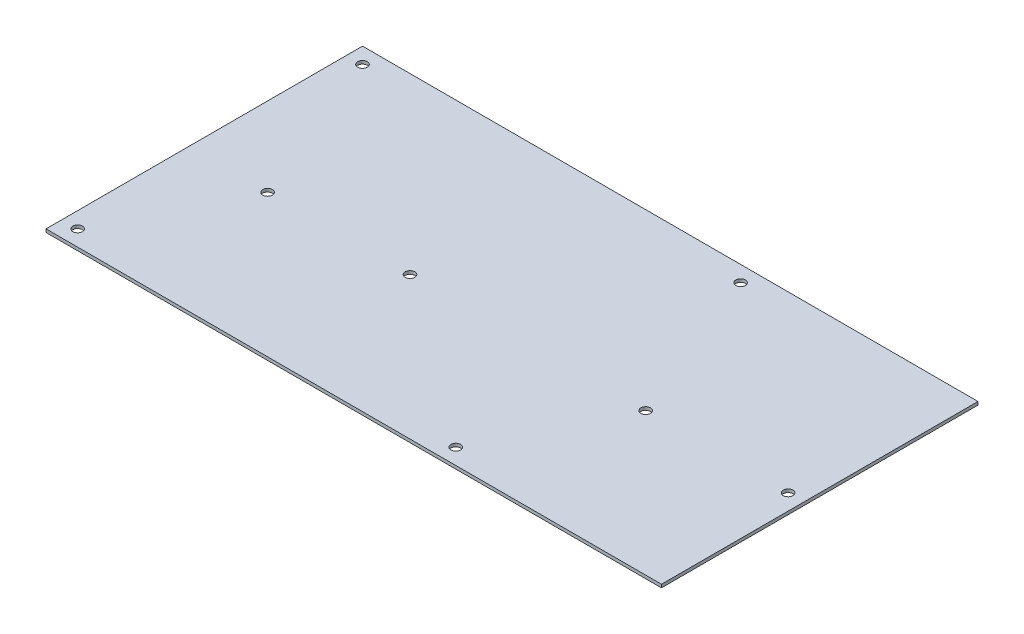
ISO-10303-21;
HEADER;
FILE_DESCRIPTION(('STEP AP214'),'2;1');
FILE_NAME('part.step','',(''),(''),'','','');
FILE_SCHEMA(('AUTOMOTIVE_DESIGN { 1 0 10303 214 1 1 1 1 }'));
ENDSEC;
DATA;
#1=APPLICATION_CONTEXT('core data for automotive mechanical design processes');
#2=APPLICATION_PROTOCOL_DEFINITION('international standard','automotive_design',2000,#1);
#3=PRODUCT_CONTEXT('',#1,'mechanical');
#4=PRODUCT('Part','Part','',(#3));
#5=PRODUCT_RELATED_PRODUCT_CATEGORY('part','',(#4));
#6=PRODUCT_DEFINITION_FORMATION('','',#4);
#7=PRODUCT_DEFINITION_CONTEXT('part definition',#1,'design');
#8=PRODUCT_DEFINITION('design','',#6,#7);
#9=PRODUCT_DEFINITION_SHAPE('','',#8);
#10=(LENGTH_UNIT() NAMED_UNIT(*) SI_UNIT(.MILLI.,.METRE.));
#11=(NAMED_UNIT(*) PLANE_ANGLE_UNIT() SI_UNIT($,.RADIAN.));
#12=(NAMED_UNIT(*) SI_UNIT($,.STERADIAN.) SOLID_ANGLE_UNIT());
#13=UNCERTAINTY_MEASURE_WITH_UNIT(LENGTH_MEASURE(1.E-05),#10,'distance_accuracy_value','');
#14=(GEOMETRIC_REPRESENTATION_CONTEXT(3) GLOBAL_UNCERTAINTY_ASSIGNED_CONTEXT((#13)) GLOBAL_UNIT_ASSIGNED_CONTEXT((#10,
#11,#12)) REPRESENTATION_CONTEXT('',''));
#15=CARTESIAN_POINT('',(0.,0.,0.));
#16=DIRECTION('',(0.,0.,1.));
#17=DIRECTION('',(1.,0.,0.));
#18=AXIS2_PLACEMENT_3D('',#15,#16,#17);
#19=CARTESIAN_POINT('',(0.,1.,0.));
#20=DIRECTION('',(0.,1.,0.));
#21=DIRECTION('',(0.,0.,1.));
#22=AXIS2_PLACEMENT_3D('',#19,#20,#21);
#23=PLANE('',#22);
#24=CARTESIAN_POINT('',(124.45,1.,-5.00000000000001));
#25=DIRECTION('',(0.,1.,0.));
#26=DIRECTION('',(0.,0.,1.));
#27=AXIS2_PLACEMENT_3D('',#24,#25,#26);
#28=CIRCLE('',#27,1.52400000000002);
#29=CARTESIAN_POINT('',(124.45,1.,-3.47599999999999));
#30=VERTEX_POINT('',#29);
#31=EDGE_CURVE('E196',#30,#30,#28,.T.);
#32=ORIENTED_EDGE('',*,*,#31,.F.);
#33=EDGE_LOOP('',(#32));
#34=FACE_BOUND('',#33,.T.);
#35=CARTESIAN_POINT('',(124.45,1.,-95.));
#36=DIRECTION('',(0.,1.,0.));
#37=DIRECTION('',(0.,0.,1.));
#38=AXIS2_PLACEMENT_3D('',#35,#36,#37);
#39=CIRCLE('',#38,1.52400000000001);
#40=CARTESIAN_POINT('',(124.45,1.,-93.476));
#41=VERTEX_POINT('',#40);
#42=EDGE_CURVE('E180',#41,#41,#39,.T.);
#43=ORIENTED_EDGE('',*,*,#42,.F.);
#44=EDGE_LOOP('',(#43));
#45=FACE_BOUND('',#44,.T.);
#46=CARTESIAN_POINT('',(5.00000000000002,1.,-5.00000000000001));
#47=DIRECTION('',(0.,1.,0.));
#48=DIRECTION('',(0.,0.,1.));
#49=AXIS2_PLACEMENT_3D('',#46,#47,#48);
#50=CIRCLE('',#49,1.52399999999999);
#51=CARTESIAN_POINT('',(5.00000000000002,1.,-3.47600000000001));
#52=VERTEX_POINT('',#51);
#53=EDGE_CURVE('E137',#52,#52,#50,.T.);
#54=ORIENTED_EDGE('',*,*,#53,.F.);
#55=EDGE_LOOP('',(#54));
#56=FACE_BOUND('',#55,.T.);
#57=CARTESIAN_POINT('',(5.,1.,-95.));
#58=DIRECTION('',(0.,1.,0.));
#59=DIRECTION('',(0.,0.,1.));
#60=AXIS2_PLACEMENT_3D('',#57,#58,#59);
#61=CIRCLE('',#60,1.52399999999999);
#62=CARTESIAN_POINT('',(5.,1.,-93.476));
#63=VERTEX_POINT('',#62);
#64=EDGE_CURVE('E138',#63,#63,#61,.T.);
#65=ORIENTED_EDGE('',*,*,#64,.F.);
#66=EDGE_LOOP('',(#65));
#67=FACE_BOUND('',#66,.T.);
#68=DIRECTION('',(0.,0.,1.));
#69=VECTOR('',#68,1.);
#70=CARTESIAN_POINT('',(0.,1.,-100.));
#71=LINE('',#70,#69);
#72=CARTESIAN_POINT('',(0.,1.,-100.));
#73=VERTEX_POINT('',#72);
#74=CARTESIAN_POINT('',(0.,1.,0.));
#75=VERTEX_POINT('',#74);
#76=EDGE_CURVE('E97',#73,#75,#71,.T.);
#77=ORIENTED_EDGE('',*,*,#76,.T.);
#78=DIRECTION('',(1.,0.,0.));
#79=VECTOR('',#78,1.);
#80=CARTESIAN_POINT('',(0.,1.,0.));
#81=LINE('',#80,#79);
#82=CARTESIAN_POINT('',(194.45,1.,0.));
#83=VERTEX_POINT('',#82);
#84=EDGE_CURVE('E92',#75,#83,#81,.T.);
#85=ORIENTED_EDGE('',*,*,#84,.T.);
#86=DIRECTION('',(0.,0.,-1.));
#87=VECTOR('',#86,1.);
#88=CARTESIAN_POINT('',(194.45,1.,-100.));
#89=LINE('',#88,#87);
#90=CARTESIAN_POINT('',(194.45,1.,-100.));
#91=VERTEX_POINT('',#90);
#92=EDGE_CURVE('E95',#83,#91,#89,.T.);
#93=ORIENTED_EDGE('',*,*,#92,.T.);
#94=DIRECTION('',(-1.,0.,0.));
#95=VECTOR('',#94,1.);
#96=CARTESIAN_POINT('',(0.,1.,-100.));
#97=LINE('',#96,#95);
#98=EDGE_CURVE('E62',#91,#73,#97,.T.);
#99=ORIENTED_EDGE('',*,*,#98,.T.);
#100=EDGE_LOOP('',(#77,#85,#93,#99));
#101=FACE_BOUND('',#100,.T.);
#102=CARTESIAN_POINT('',(70.,1.,-45.));
#103=DIRECTION('',(0.,1.,0.));
#104=DIRECTION('',(0.,0.,1.));
#105=AXIS2_PLACEMENT_3D('',#102,#103,#104);
#106=CIRCLE('',#105,1.52399999999999);
#107=CARTESIAN_POINT('',(70.,1.,-43.476));
#108=VERTEX_POINT('',#107);
#109=EDGE_CURVE('E124',#108,#108,#106,.T.);
#110=ORIENTED_EDGE('',*,*,#109,.F.);
#111=EDGE_LOOP('',(#110));
#112=FACE_BOUND('',#111,.T.);
#113=CARTESIAN_POINT('',(25.,1.,-45.));
#114=DIRECTION('',(0.,1.,0.));
#115=DIRECTION('',(0.,0.,1.));
#116=AXIS2_PLACEMENT_3D('',#113,#114,#115);
#117=CIRCLE('',#116,1.52399999999999);
#118=CARTESIAN_POINT('',(25.,1.,-43.476));
#119=VERTEX_POINT('',#118);
#120=EDGE_CURVE('E174',#119,#119,#117,.T.);
#121=ORIENTED_EDGE('',*,*,#120,.F.);
#122=EDGE_LOOP('',(#121));
#123=FACE_BOUND('',#122,.T.);
#124=CARTESIAN_POINT('',(189.45,1.,-45.));
#125=DIRECTION('',(0.,1.,0.));
#126=DIRECTION('',(0.,0.,1.));
#127=AXIS2_PLACEMENT_3D('',#124,#125,#126);
#128=CIRCLE('',#127,1.52400000000001);
#129=CARTESIAN_POINT('',(189.45,1.,-43.476));
#130=VERTEX_POINT('',#129);
#131=EDGE_CURVE('E188',#130,#130,#128,.T.);
#132=ORIENTED_EDGE('',*,*,#131,.F.);
#133=EDGE_LOOP('',(#132));
#134=FACE_BOUND('',#133,.T.);
#135=CARTESIAN_POINT('',(144.45,1.,-45.));
#136=DIRECTION('',(0.,1.,0.));
#137=DIRECTION('',(0.,0.,1.));
#138=AXIS2_PLACEMENT_3D('',#135,#136,#137);
#139=CIRCLE('',#138,1.52400000000001);
#140=CARTESIAN_POINT('',(144.45,1.,-43.476));
#141=VERTEX_POINT('',#140);
#142=EDGE_CURVE('E204',#141,#141,#139,.T.);
#143=ORIENTED_EDGE('',*,*,#142,.F.);
#144=EDGE_LOOP('',(#143));
#145=FACE_BOUND('',#144,.T.);
#146=ADVANCED_FACE('F44',(#34,#45,#56,#67,#101,#112,#123,#134,#145),#23,.T.);
#147=CARTESIAN_POINT('',(0.,0.,0.));
#148=DIRECTION('',(0.,1.,0.));
#149=DIRECTION('',(0.,0.,1.));
#150=AXIS2_PLACEMENT_3D('',#147,#148,#149);
#151=PLANE('',#150);
#152=DIRECTION('',(0.,0.,1.));
#153=VECTOR('',#152,1.);
#154=CARTESIAN_POINT('',(0.,0.,-100.));
#155=LINE('',#154,#153);
#156=CARTESIAN_POINT('',(0.,0.,-100.));
#157=VERTEX_POINT('',#156);
#158=CARTESIAN_POINT('',(0.,0.,0.));
#159=VERTEX_POINT('',#158);
#160=EDGE_CURVE('E143',#157,#159,#155,.T.);
#161=ORIENTED_EDGE('',*,*,#160,.F.);
#162=DIRECTION('',(-1.,0.,0.));
#163=VECTOR('',#162,1.);
#164=CARTESIAN_POINT('',(0.,0.,-100.));
#165=LINE('',#164,#163);
#166=CARTESIAN_POINT('',(194.45,0.,-100.));
#167=VERTEX_POINT('',#166);
#168=EDGE_CURVE('E85',#167,#157,#165,.T.);
#169=ORIENTED_EDGE('',*,*,#168,.F.);
#170=DIRECTION('',(0.,0.,-1.));
#171=VECTOR('',#170,1.);
#172=CARTESIAN_POINT('',(194.45,0.,-100.));
#173=LINE('',#172,#171);
#174=CARTESIAN_POINT('',(194.45,0.,0.));
#175=VERTEX_POINT('',#174);
#176=EDGE_CURVE('E79',#175,#167,#173,.T.);
#177=ORIENTED_EDGE('',*,*,#176,.F.);
#178=DIRECTION('',(1.,0.,0.));
#179=VECTOR('',#178,1.);
#180=CARTESIAN_POINT('',(0.,0.,0.));
#181=LINE('',#180,#179);
#182=EDGE_CURVE('E102',#159,#175,#181,.T.);
#183=ORIENTED_EDGE('',*,*,#182,.F.);
#184=EDGE_LOOP('',(#161,#169,#177,#183));
#185=FACE_BOUND('',#184,.T.);
#186=CARTESIAN_POINT('',(5.,0.,-95.));
#187=DIRECTION('',(0.,1.,0.));
#188=DIRECTION('',(0.,0.,1.));
#189=AXIS2_PLACEMENT_3D('',#186,#187,#188);
#190=CIRCLE('',#189,1.52399999999999);
#191=CARTESIAN_POINT('',(5.,0.,-93.476));
#192=VERTEX_POINT('',#191);
#193=EDGE_CURVE('E130',#192,#192,#190,.T.);
#194=ORIENTED_EDGE('',*,*,#193,.T.);
#195=EDGE_LOOP('',(#194));
#196=FACE_BOUND('',#195,.T.);
#197=CARTESIAN_POINT('',(70.,0.,-45.));
#198=DIRECTION('',(0.,1.,0.));
#199=DIRECTION('',(0.,0.,1.));
#200=AXIS2_PLACEMENT_3D('',#197,#198,#199);
#201=CIRCLE('',#200,1.52399999999999);
#202=CARTESIAN_POINT('',(70.,0.,-43.476));
#203=VERTEX_POINT('',#202);
#204=EDGE_CURVE('E131',#203,#203,#201,.T.);
#205=ORIENTED_EDGE('',*,*,#204,.T.);
#206=EDGE_LOOP('',(#205));
#207=FACE_BOUND('',#206,.T.);
#208=CARTESIAN_POINT('',(5.00000000000002,0.,-5.00000000000001));
#209=DIRECTION('',(0.,1.,0.));
#210=DIRECTION('',(0.,0.,1.));
#211=AXIS2_PLACEMENT_3D('',#208,#209,#210);
#212=CIRCLE('',#211,1.52399999999999);
#213=CARTESIAN_POINT('',(5.00000000000002,0.,-3.47600000000001));
#214=VERTEX_POINT('',#213);
#215=EDGE_CURVE('E132',#214,#214,#212,.T.);
#216=ORIENTED_EDGE('',*,*,#215,.T.);
#217=EDGE_LOOP('',(#216));
#218=FACE_BOUND('',#217,.T.);
#219=CARTESIAN_POINT('',(25.,0.,-45.));
#220=DIRECTION('',(0.,1.,0.));
#221=DIRECTION('',(0.,0.,1.));
#222=AXIS2_PLACEMENT_3D('',#219,#220,#221);
#223=CIRCLE('',#222,1.52399999999999);
#224=CARTESIAN_POINT('',(25.,0.,-43.476));
#225=VERTEX_POINT('',#224);
#226=EDGE_CURVE('E177',#225,#225,#223,.T.);
#227=ORIENTED_EDGE('',*,*,#226,.T.);
#228=EDGE_LOOP('',(#227));
#229=FACE_BOUND('',#228,.T.);
#230=CARTESIAN_POINT('',(124.45,0.,-95.));
#231=DIRECTION('',(0.,1.,0.));
#232=DIRECTION('',(0.,0.,1.));
#233=AXIS2_PLACEMENT_3D('',#230,#231,#232);
#234=CIRCLE('',#233,1.52400000000001);
#235=CARTESIAN_POINT('',(124.45,0.,-93.476));
#236=VERTEX_POINT('',#235);
#237=EDGE_CURVE('E184',#236,#236,#234,.T.);
#238=ORIENTED_EDGE('',*,*,#237,.T.);
#239=EDGE_LOOP('',(#238));
#240=FACE_BOUND('',#239,.T.);
#241=CARTESIAN_POINT('',(189.45,0.,-45.));
#242=DIRECTION('',(0.,1.,0.));
#243=DIRECTION('',(0.,0.,1.));
#244=AXIS2_PLACEMENT_3D('',#241,#242,#243);
#245=CIRCLE('',#244,1.52400000000001);
#246=CARTESIAN_POINT('',(189.45,0.,-43.476));
#247=VERTEX_POINT('',#246);
#248=EDGE_CURVE('E192',#247,#247,#245,.T.);
#249=ORIENTED_EDGE('',*,*,#248,.T.);
#250=EDGE_LOOP('',(#249));
#251=FACE_BOUND('',#250,.T.);
#252=CARTESIAN_POINT('',(124.45,0.,-5.00000000000001));
#253=DIRECTION('',(0.,1.,0.));
#254=DIRECTION('',(0.,0.,1.));
#255=AXIS2_PLACEMENT_3D('',#252,#253,#254);
#256=CIRCLE('',#255,1.52400000000002);
#257=CARTESIAN_POINT('',(124.45,0.,-3.47599999999999));
#258=VERTEX_POINT('',#257);
#259=EDGE_CURVE('E200',#258,#258,#256,.T.);
#260=ORIENTED_EDGE('',*,*,#259,.T.);
#261=EDGE_LOOP('',(#260));
#262=FACE_BOUND('',#261,.T.);
#263=CARTESIAN_POINT('',(144.45,0.,-45.));
#264=DIRECTION('',(0.,1.,0.));
#265=DIRECTION('',(0.,0.,1.));
#266=AXIS2_PLACEMENT_3D('',#263,#264,#265);
#267=CIRCLE('',#266,1.52400000000001);
#268=CARTESIAN_POINT('',(144.45,0.,-43.476));
#269=VERTEX_POINT('',#268);
#270=EDGE_CURVE('E208',#269,#269,#267,.T.);
#271=ORIENTED_EDGE('',*,*,#270,.T.);
#272=EDGE_LOOP('',(#271));
#273=FACE_BOUND('',#272,.T.);
#274=ADVANCED_FACE('F161',(#185,#196,#207,#218,#229,#240,#251,#262,#273),#151,.F.);
#275=CARTESIAN_POINT('',(0.,1.,-100.));
#276=DIRECTION('',(1.,0.,0.));
#277=DIRECTION('',(0.,0.,-1.));
#278=AXIS2_PLACEMENT_3D('',#275,#276,#277);
#279=PLANE('',#278);
#280=ORIENTED_EDGE('',*,*,#160,.T.);
#281=DIRECTION('',(0.,-1.,0.));
#282=VECTOR('',#281,1.);
#283=CARTESIAN_POINT('',(0.,1.,0.));
#284=LINE('',#283,#282);
#285=EDGE_CURVE('E12',#75,#159,#284,.T.);
#286=ORIENTED_EDGE('',*,*,#285,.F.);
#287=ORIENTED_EDGE('',*,*,#76,.F.);
#288=DIRECTION('',(0.,-1.,0.));
#289=VECTOR('',#288,1.);
#290=CARTESIAN_POINT('',(0.,1.,-100.));
#291=LINE('',#290,#289);
#292=EDGE_CURVE('E109',#73,#157,#291,.T.);
#293=ORIENTED_EDGE('',*,*,#292,.T.);
#294=EDGE_LOOP('',(#280,#286,#287,#293));
#295=FACE_BOUND('',#294,.T.);
#296=ADVANCED_FACE('F46',(#295),#279,.F.);
#297=CARTESIAN_POINT('',(0.,1.,0.));
#298=DIRECTION('',(0.,0.,-1.));
#299=DIRECTION('',(-1.,0.,0.));
#300=AXIS2_PLACEMENT_3D('',#297,#298,#299);
#301=PLANE('',#300);
#302=ORIENTED_EDGE('',*,*,#182,.T.);
#303=DIRECTION('',(0.,-1.,0.));
#304=VECTOR('',#303,1.);
#305=CARTESIAN_POINT('',(194.45,1.,0.));
#306=LINE('',#305,#304);
#307=EDGE_CURVE('E54',#83,#175,#306,.T.);
#308=ORIENTED_EDGE('',*,*,#307,.F.);
#309=ORIENTED_EDGE('',*,*,#84,.F.);
#310=ORIENTED_EDGE('',*,*,#285,.T.);
#311=EDGE_LOOP('',(#302,#308,#309,#310));
#312=FACE_BOUND('',#311,.T.);
#313=ADVANCED_FACE('F101',(#312),#301,.F.);
#314=CARTESIAN_POINT('',(194.45,1.,-100.));
#315=DIRECTION('',(-1.,0.,0.));
#316=DIRECTION('',(0.,0.,1.));
#317=AXIS2_PLACEMENT_3D('',#314,#315,#316);
#318=PLANE('',#317);
#319=ORIENTED_EDGE('',*,*,#176,.T.);
#320=DIRECTION('',(0.,-1.,0.));
#321=VECTOR('',#320,1.);
#322=CARTESIAN_POINT('',(194.45,1.,-100.));
#323=LINE('',#322,#321);
#324=EDGE_CURVE('E104',#91,#167,#323,.T.);
#325=ORIENTED_EDGE('',*,*,#324,.F.);
#326=ORIENTED_EDGE('',*,*,#92,.F.);
#327=ORIENTED_EDGE('',*,*,#307,.T.);
#328=EDGE_LOOP('',(#319,#325,#326,#327));
#329=FACE_BOUND('',#328,.T.);
#330=ADVANCED_FACE('F105',(#329),#318,.F.);
#331=CARTESIAN_POINT('',(0.,1.,-100.));
#332=DIRECTION('',(0.,0.,1.));
#333=DIRECTION('',(1.,0.,0.));
#334=AXIS2_PLACEMENT_3D('',#331,#332,#333);
#335=PLANE('',#334);
#336=ORIENTED_EDGE('',*,*,#168,.T.);
#337=ORIENTED_EDGE('',*,*,#292,.F.);
#338=ORIENTED_EDGE('',*,*,#98,.F.);
#339=ORIENTED_EDGE('',*,*,#324,.T.);
#340=EDGE_LOOP('',(#336,#337,#338,#339));
#341=FACE_BOUND('',#340,.T.);
#342=ADVANCED_FACE('F158',(#341),#335,.F.);
#343=CARTESIAN_POINT('',(5.,1.,-95.));
#344=DIRECTION('',(0.,-1.,0.));
#345=DIRECTION('',(0.,0.,-1.));
#346=AXIS2_PLACEMENT_3D('',#343,#344,#345);
#347=CYLINDRICAL_SURFACE('',#346,1.52399999999999);
#348=ORIENTED_EDGE('',*,*,#64,.T.);
#349=EDGE_LOOP('',(#348));
#350=FACE_BOUND('',#349,.T.);
#351=ORIENTED_EDGE('',*,*,#193,.F.);
#352=EDGE_LOOP('',(#351));
#353=FACE_BOUND('',#352,.T.);
#354=ADVANCED_FACE('F242',(#350,#353),#347,.F.);
#355=CARTESIAN_POINT('',(70.,1.,-45.));
#356=DIRECTION('',(0.,-1.,0.));
#357=DIRECTION('',(0.,0.,-1.));
#358=AXIS2_PLACEMENT_3D('',#355,#356,#357);
#359=CYLINDRICAL_SURFACE('',#358,1.52399999999999);
#360=ORIENTED_EDGE('',*,*,#109,.T.);
#361=EDGE_LOOP('',(#360));
#362=FACE_BOUND('',#361,.T.);
#363=ORIENTED_EDGE('',*,*,#204,.F.);
#364=EDGE_LOOP('',(#363));
#365=FACE_BOUND('',#364,.T.);
#366=ADVANCED_FACE('F296',(#362,#365),#359,.F.);
#367=CARTESIAN_POINT('',(5.00000000000002,1.,-5.00000000000001));
#368=DIRECTION('',(0.,-1.,0.));
#369=DIRECTION('',(0.,0.,-1.));
#370=AXIS2_PLACEMENT_3D('',#367,#368,#369);
#371=CYLINDRICAL_SURFACE('',#370,1.52399999999999);
#372=ORIENTED_EDGE('',*,*,#53,.T.);
#373=EDGE_LOOP('',(#372));
#374=FACE_BOUND('',#373,.T.);
#375=ORIENTED_EDGE('',*,*,#215,.F.);
#376=EDGE_LOOP('',(#375));
#377=FACE_BOUND('',#376,.T.);
#378=ADVANCED_FACE('F305',(#374,#377),#371,.F.);
#379=CARTESIAN_POINT('',(25.,1.,-45.));
#380=DIRECTION('',(0.,-1.,0.));
#381=DIRECTION('',(0.,0.,-1.));
#382=AXIS2_PLACEMENT_3D('',#379,#380,#381);
#383=CYLINDRICAL_SURFACE('',#382,1.52399999999999);
#384=ORIENTED_EDGE('',*,*,#120,.T.);
#385=EDGE_LOOP('',(#384));
#386=FACE_BOUND('',#385,.T.);
#387=ORIENTED_EDGE('',*,*,#226,.F.);
#388=EDGE_LOOP('',(#387));
#389=FACE_BOUND('',#388,.T.);
#390=ADVANCED_FACE('F314',(#386,#389),#383,.F.);
#391=CARTESIAN_POINT('',(124.45,1.,-95.));
#392=DIRECTION('',(0.,-1.,0.));
#393=DIRECTION('',(0.,0.,-1.));
#394=AXIS2_PLACEMENT_3D('',#391,#392,#393);
#395=CYLINDRICAL_SURFACE('',#394,1.52400000000001);
#396=ORIENTED_EDGE('',*,*,#42,.T.);
#397=EDGE_LOOP('',(#396));
#398=FACE_BOUND('',#397,.T.);
#399=ORIENTED_EDGE('',*,*,#237,.F.);
#400=EDGE_LOOP('',(#399));
#401=FACE_BOUND('',#400,.T.);
#402=ADVANCED_FACE('F324',(#398,#401),#395,.F.);
#403=CARTESIAN_POINT('',(189.45,1.,-45.));
#404=DIRECTION('',(0.,-1.,0.));
#405=DIRECTION('',(0.,0.,-1.));
#406=AXIS2_PLACEMENT_3D('',#403,#404,#405);
#407=CYLINDRICAL_SURFACE('',#406,1.52400000000001);
#408=ORIENTED_EDGE('',*,*,#131,.T.);
#409=EDGE_LOOP('',(#408));
#410=FACE_BOUND('',#409,.T.);
#411=ORIENTED_EDGE('',*,*,#248,.F.);
#412=EDGE_LOOP('',(#411));
#413=FACE_BOUND('',#412,.T.);
#414=ADVANCED_FACE('F229',(#410,#413),#407,.F.);
#415=CARTESIAN_POINT('',(124.45,1.,-5.00000000000001));
#416=DIRECTION('',(0.,-1.,0.));
#417=DIRECTION('',(0.,0.,-1.));
#418=AXIS2_PLACEMENT_3D('',#415,#416,#417);
#419=CYLINDRICAL_SURFACE('',#418,1.52400000000002);
#420=ORIENTED_EDGE('',*,*,#31,.T.);
#421=EDGE_LOOP('',(#420));
#422=FACE_BOUND('',#421,.T.);
#423=ORIENTED_EDGE('',*,*,#259,.F.);
#424=EDGE_LOOP('',(#423));
#425=FACE_BOUND('',#424,.T.);
#426=ADVANCED_FACE('F223',(#422,#425),#419,.F.);
#427=CARTESIAN_POINT('',(144.45,1.,-45.));
#428=DIRECTION('',(0.,-1.,0.));
#429=DIRECTION('',(0.,0.,-1.));
#430=AXIS2_PLACEMENT_3D('',#427,#428,#429);
#431=CYLINDRICAL_SURFACE('',#430,1.52400000000001);
#432=ORIENTED_EDGE('',*,*,#142,.T.);
#433=EDGE_LOOP('',(#432));
#434=FACE_BOUND('',#433,.T.);
#435=ORIENTED_EDGE('',*,*,#270,.F.);
#436=EDGE_LOOP('',(#435));
#437=FACE_BOUND('',#436,.T.);
#438=ADVANCED_FACE('F221',(#434,#437),#431,.F.);
#439=CLOSED_SHELL('',(#146,#274,#296,#313,#330,#342,#354,#366,#378,#390,#402,#414,#426,#438));
#440=MANIFOLD_SOLID_BREP('B2',#439);
#441=ADVANCED_BREP_SHAPE_REPRESENTATION('',(#18,#440),#14);
#442=SHAPE_DEFINITION_REPRESENTATION(#9,#441);
ENDSEC;
END-ISO-10303-21;
